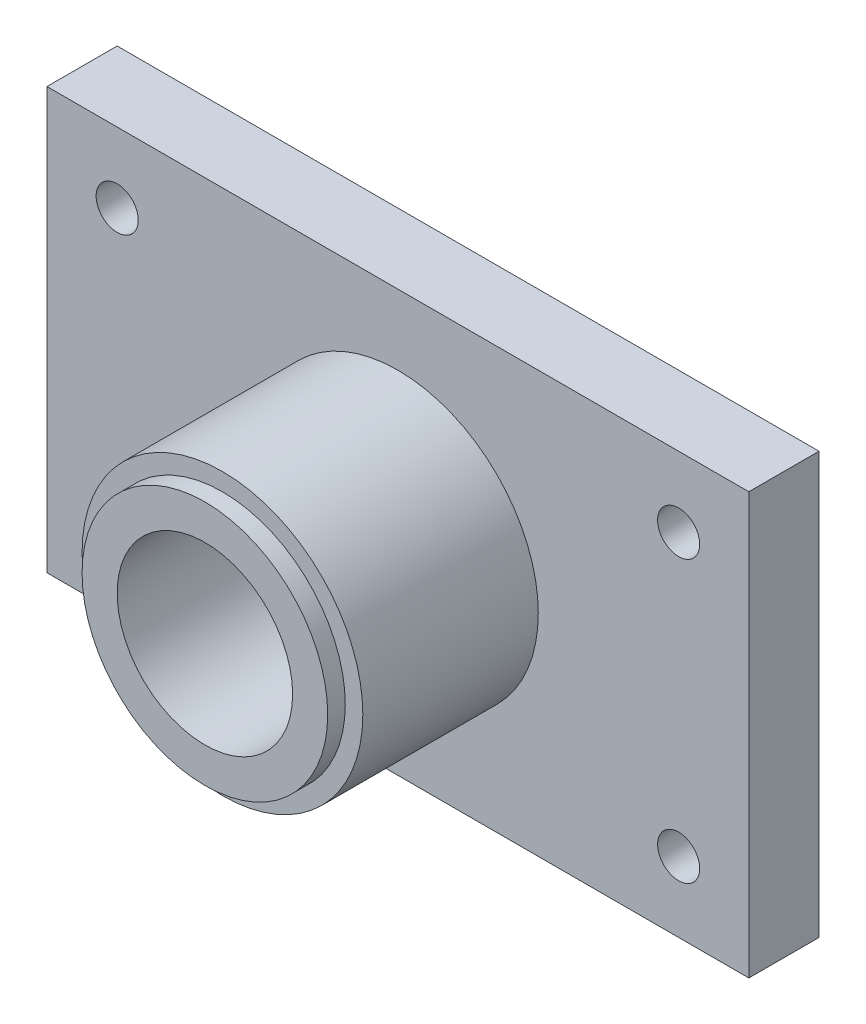
ISO-10303-21;
HEADER;
FILE_DESCRIPTION(('STEP AP214'),'2;1');
FILE_NAME('part.step','',(''),(''),'','','');
FILE_SCHEMA(('AUTOMOTIVE_DESIGN { 1 0 10303 214 1 1 1 1 }'));
ENDSEC;
DATA;
#1=APPLICATION_CONTEXT('core data for automotive mechanical design processes');
#2=APPLICATION_PROTOCOL_DEFINITION('international standard','automotive_design',2000,#1);
#3=PRODUCT_CONTEXT('',#1,'mechanical');
#4=PRODUCT('Part','Part','',(#3));
#5=PRODUCT_RELATED_PRODUCT_CATEGORY('part','',(#4));
#6=PRODUCT_DEFINITION_FORMATION('','',#4);
#7=PRODUCT_DEFINITION_CONTEXT('part definition',#1,'design');
#8=PRODUCT_DEFINITION('design','',#6,#7);
#9=PRODUCT_DEFINITION_SHAPE('','',#8);
#10=(LENGTH_UNIT() NAMED_UNIT(*) SI_UNIT(.MILLI.,.METRE.));
#11=(NAMED_UNIT(*) PLANE_ANGLE_UNIT() SI_UNIT($,.RADIAN.));
#12=(NAMED_UNIT(*) SI_UNIT($,.STERADIAN.) SOLID_ANGLE_UNIT());
#13=UNCERTAINTY_MEASURE_WITH_UNIT(LENGTH_MEASURE(1.E-05),#10,'distance_accuracy_value','');
#14=(GEOMETRIC_REPRESENTATION_CONTEXT(3) GLOBAL_UNCERTAINTY_ASSIGNED_CONTEXT((#13)) GLOBAL_UNIT_ASSIGNED_CONTEXT((#10,
#11,#12)) REPRESENTATION_CONTEXT('',''));
#15=CARTESIAN_POINT('',(0.,0.,0.));
#16=DIRECTION('',(0.,0.,1.));
#17=DIRECTION('',(1.,0.,0.));
#18=AXIS2_PLACEMENT_3D('',#15,#16,#17);
#19=CARTESIAN_POINT('',(0.,0.,20.));
#20=DIRECTION('',(0.,0.,1.));
#21=DIRECTION('',(1.,0.,0.));
#22=AXIS2_PLACEMENT_3D('',#19,#20,#21);
#23=PLANE('',#22);
#24=CARTESIAN_POINT('',(0.,0.,20.));
#25=DIRECTION('',(0.,0.,-1.));
#26=DIRECTION('',(1.,0.,0.));
#27=AXIS2_PLACEMENT_3D('',#24,#25,#26);
#28=CIRCLE('',#27,25.);
#29=CARTESIAN_POINT('',(25.,0.,20.));
#30=VERTEX_POINT('',#29);
#31=EDGE_CURVE('E19',#30,#30,#28,.T.);
#32=ORIENTED_EDGE('',*,*,#31,.F.);
#33=EDGE_LOOP('',(#32));
#34=FACE_BOUND('',#33,.T.);
#35=ADVANCED_FACE('F16',(#34),#23,.T.);
#36=CARTESIAN_POINT('',(0.,0.,0.));
#37=DIRECTION('',(0.,0.,-1.));
#38=DIRECTION('',(1.,0.,0.));
#39=AXIS2_PLACEMENT_3D('',#36,#37,#38);
#40=CYLINDRICAL_SURFACE('',#39,25.);
#41=ORIENTED_EDGE('',*,*,#31,.T.);
#42=DIRECTION('',(0.,0.,1.));
#43=VECTOR('',#42,1.);
#44=CARTESIAN_POINT('',(25.,0.,0.));
#45=LINE('',#44,#43);
#46=CARTESIAN_POINT('',(25.,0.,75.));
#47=VERTEX_POINT('',#46);
#48=EDGE_CURVE('E10',#30,#47,#45,.T.);
#49=ORIENTED_EDGE('',*,*,#48,.T.);
#50=CARTESIAN_POINT('',(0.,0.,75.));
#51=DIRECTION('',(0.,0.,-1.));
#52=DIRECTION('',(1.,0.,0.));
#53=AXIS2_PLACEMENT_3D('',#50,#51,#52);
#54=CIRCLE('',#53,25.);
#55=EDGE_CURVE('E245',#47,#47,#54,.T.);
#56=ORIENTED_EDGE('',*,*,#55,.F.);
#57=ORIENTED_EDGE('',*,*,#48,.F.);
#58=EDGE_LOOP('',(#41,#49,#56,#57));
#59=FACE_BOUND('',#58,.T.);
#60=ADVANCED_FACE('F253',(#59),#40,.F.);
#61=CARTESIAN_POINT('',(0.,0.,75.));
#62=DIRECTION('',(0.,0.,1.));
#63=DIRECTION('',(1.,0.,0.));
#64=AXIS2_PLACEMENT_3D('',#61,#62,#63);
#65=PLANE('',#64);
#66=ORIENTED_EDGE('',*,*,#55,.T.);
#67=EDGE_LOOP('',(#66));
#68=FACE_BOUND('',#67,.T.);
#69=CARTESIAN_POINT('',(0.,0.,75.));
#70=DIRECTION('',(0.,0.,1.));
#71=DIRECTION('',(1.,0.,0.));
#72=AXIS2_PLACEMENT_3D('',#69,#70,#71);
#73=CIRCLE('',#72,35.);
#74=CARTESIAN_POINT('',(35.,0.,75.));
#75=VERTEX_POINT('',#74);
#76=EDGE_CURVE('E243',#75,#75,#73,.T.);
#77=ORIENTED_EDGE('',*,*,#76,.T.);
#78=EDGE_LOOP('',(#77));
#79=FACE_BOUND('',#78,.T.);
#80=ADVANCED_FACE('F260',(#68,#79),#65,.T.);
#81=CARTESIAN_POINT('',(0.,0.,70.));
#82=DIRECTION('',(0.,0.,1.));
#83=DIRECTION('',(1.,0.,0.));
#84=AXIS2_PLACEMENT_3D('',#81,#82,#83);
#85=CYLINDRICAL_SURFACE('',#84,35.);
#86=CARTESIAN_POINT('',(0.,0.,70.));
#87=DIRECTION('',(0.,0.,1.));
#88=DIRECTION('',(1.,0.,0.));
#89=AXIS2_PLACEMENT_3D('',#86,#87,#88);
#90=CIRCLE('',#89,35.);
#91=CARTESIAN_POINT('',(35.,0.,70.));
#92=VERTEX_POINT('',#91);
#93=EDGE_CURVE('E179',#92,#92,#90,.T.);
#94=ORIENTED_EDGE('',*,*,#93,.T.);
#95=DIRECTION('',(0.,0.,1.));
#96=VECTOR('',#95,1.);
#97=CARTESIAN_POINT('',(35.,0.,70.));
#98=LINE('',#97,#96);
#99=EDGE_CURVE('E183',#92,#75,#98,.T.);
#100=ORIENTED_EDGE('',*,*,#99,.T.);
#101=ORIENTED_EDGE('',*,*,#76,.F.);
#102=ORIENTED_EDGE('',*,*,#99,.F.);
#103=EDGE_LOOP('',(#94,#100,#101,#102));
#104=FACE_BOUND('',#103,.T.);
#105=ADVANCED_FACE('F265',(#104),#85,.T.);
#106=CARTESIAN_POINT('',(0.,0.,70.));
#107=DIRECTION('',(0.,0.,1.));
#108=DIRECTION('',(1.,0.,0.));
#109=AXIS2_PLACEMENT_3D('',#106,#107,#108);
#110=PLANE('',#109);
#111=ORIENTED_EDGE('',*,*,#93,.F.);
#112=EDGE_LOOP('',(#111));
#113=FACE_BOUND('',#112,.T.);
#114=CARTESIAN_POINT('',(0.,0.,70.));
#115=DIRECTION('',(0.,0.,-1.));
#116=DIRECTION('',(1.,0.,0.));
#117=AXIS2_PLACEMENT_3D('',#114,#115,#116);
#118=CIRCLE('',#117,40.);
#119=CARTESIAN_POINT('',(40.,0.,70.));
#120=VERTEX_POINT('',#119);
#121=EDGE_CURVE('E184',#120,#120,#118,.T.);
#122=ORIENTED_EDGE('',*,*,#121,.F.);
#123=EDGE_LOOP('',(#122));
#124=FACE_BOUND('',#123,.T.);
#125=ADVANCED_FACE('F290',(#113,#124),#110,.T.);
#126=CARTESIAN_POINT('',(0.,0.,20.));
#127=DIRECTION('',(0.,0.,1.));
#128=DIRECTION('',(1.,0.,0.));
#129=AXIS2_PLACEMENT_3D('',#126,#127,#128);
#130=CYLINDRICAL_SURFACE('',#129,40.);
#131=DIRECTION('',(0.,0.,1.));
#132=VECTOR('',#131,1.);
#133=CARTESIAN_POINT('',(40.,0.,20.));
#134=LINE('',#133,#132);
#135=CARTESIAN_POINT('',(40.,0.,20.));
#136=VERTEX_POINT('',#135);
#137=EDGE_CURVE('E234',#136,#120,#134,.T.);
#138=ORIENTED_EDGE('',*,*,#137,.F.);
#139=CARTESIAN_POINT('',(0.,0.,20.));
#140=DIRECTION('',(0.,0.,-1.));
#141=DIRECTION('',(1.,0.,0.));
#142=AXIS2_PLACEMENT_3D('',#139,#140,#141);
#143=CIRCLE('',#142,40.);
#144=EDGE_CURVE('E230',#136,#136,#143,.T.);
#145=ORIENTED_EDGE('',*,*,#144,.F.);
#146=ORIENTED_EDGE('',*,*,#137,.T.);
#147=ORIENTED_EDGE('',*,*,#121,.T.);
#148=EDGE_LOOP('',(#138,#145,#146,#147));
#149=FACE_BOUND('',#148,.T.);
#150=ADVANCED_FACE('F297',(#149),#130,.T.);
#151=CARTESIAN_POINT('',(0.,0.,20.));
#152=DIRECTION('',(0.,0.,1.));
#153=DIRECTION('',(1.,0.,0.));
#154=AXIS2_PLACEMENT_3D('',#151,#152,#153);
#155=PLANE('',#154);
#156=ORIENTED_EDGE('',*,*,#144,.T.);
#157=EDGE_LOOP('',(#156));
#158=FACE_BOUND('',#157,.T.);
#159=CARTESIAN_POINT('',(80.,40.,20.));
#160=DIRECTION('',(0.,0.,-1.));
#161=DIRECTION('',(1.,0.,0.));
#162=AXIS2_PLACEMENT_3D('',#159,#160,#161);
#163=CIRCLE('',#162,6.);
#164=CARTESIAN_POINT('',(86.,40.,20.));
#165=VERTEX_POINT('',#164);
#166=EDGE_CURVE('E165',#165,#165,#163,.T.);
#167=ORIENTED_EDGE('',*,*,#166,.T.);
#168=EDGE_LOOP('',(#167));
#169=FACE_BOUND('',#168,.T.);
#170=CARTESIAN_POINT('',(-80.,40.,20.));
#171=DIRECTION('',(0.,0.,-1.));
#172=DIRECTION('',(1.,0.,0.));
#173=AXIS2_PLACEMENT_3D('',#170,#171,#172);
#174=CIRCLE('',#173,6.);
#175=CARTESIAN_POINT('',(-74.,40.,20.));
#176=VERTEX_POINT('',#175);
#177=EDGE_CURVE('E166',#176,#176,#174,.T.);
#178=ORIENTED_EDGE('',*,*,#177,.T.);
#179=EDGE_LOOP('',(#178));
#180=FACE_BOUND('',#179,.T.);
#181=CARTESIAN_POINT('',(80.,-40.,20.));
#182=DIRECTION('',(0.,0.,-1.));
#183=DIRECTION('',(1.,0.,0.));
#184=AXIS2_PLACEMENT_3D('',#181,#182,#183);
#185=CIRCLE('',#184,6.);
#186=CARTESIAN_POINT('',(86.,-40.,20.));
#187=VERTEX_POINT('',#186);
#188=EDGE_CURVE('E219',#187,#187,#185,.T.);
#189=ORIENTED_EDGE('',*,*,#188,.T.);
#190=EDGE_LOOP('',(#189));
#191=FACE_BOUND('',#190,.T.);
#192=CARTESIAN_POINT('',(-80.,-40.,20.));
#193=DIRECTION('',(0.,0.,-1.));
#194=DIRECTION('',(1.,0.,0.));
#195=AXIS2_PLACEMENT_3D('',#192,#193,#194);
#196=CIRCLE('',#195,6.);
#197=CARTESIAN_POINT('',(-74.,-40.,20.));
#198=VERTEX_POINT('',#197);
#199=EDGE_CURVE('E212',#198,#198,#196,.T.);
#200=ORIENTED_EDGE('',*,*,#199,.T.);
#201=EDGE_LOOP('',(#200));
#202=FACE_BOUND('',#201,.T.);
#203=DIRECTION('',(1.,0.,0.));
#204=VECTOR('',#203,1.);
#205=CARTESIAN_POINT('',(-100.,-60.,20.));
#206=LINE('',#205,#204);
#207=CARTESIAN_POINT('',(-100.,-60.,20.));
#208=VERTEX_POINT('',#207);
#209=CARTESIAN_POINT('',(100.,-60.,20.));
#210=VERTEX_POINT('',#209);
#211=EDGE_CURVE('E131',#208,#210,#206,.T.);
#212=ORIENTED_EDGE('',*,*,#211,.T.);
#213=DIRECTION('',(0.,1.,0.));
#214=VECTOR('',#213,1.);
#215=CARTESIAN_POINT('',(100.,-60.,20.));
#216=LINE('',#215,#214);
#217=CARTESIAN_POINT('',(100.,60.,20.));
#218=VERTEX_POINT('',#217);
#219=EDGE_CURVE('E201',#210,#218,#216,.T.);
#220=ORIENTED_EDGE('',*,*,#219,.T.);
#221=DIRECTION('',(-1.,0.,0.));
#222=VECTOR('',#221,1.);
#223=CARTESIAN_POINT('',(100.,60.,20.));
#224=LINE('',#223,#222);
#225=CARTESIAN_POINT('',(-100.,60.,20.));
#226=VERTEX_POINT('',#225);
#227=EDGE_CURVE('E205',#218,#226,#224,.T.);
#228=ORIENTED_EDGE('',*,*,#227,.T.);
#229=DIRECTION('',(0.,-1.,0.));
#230=VECTOR('',#229,1.);
#231=CARTESIAN_POINT('',(-100.,60.,20.));
#232=LINE('',#231,#230);
#233=EDGE_CURVE('E135',#226,#208,#232,.T.);
#234=ORIENTED_EDGE('',*,*,#233,.T.);
#235=EDGE_LOOP('',(#212,#220,#228,#234));
#236=FACE_BOUND('',#235,.T.);
#237=ADVANCED_FACE('F302',(#158,#169,#180,#191,#202,#236),#155,.T.);
#238=CARTESIAN_POINT('',(80.,40.,0.));
#239=DIRECTION('',(0.,0.,-1.));
#240=DIRECTION('',(1.,0.,0.));
#241=AXIS2_PLACEMENT_3D('',#238,#239,#240);
#242=CYLINDRICAL_SURFACE('',#241,6.);
#243=CARTESIAN_POINT('',(80.,40.,0.));
#244=DIRECTION('',(0.,0.,1.));
#245=DIRECTION('',(1.,0.,0.));
#246=AXIS2_PLACEMENT_3D('',#243,#244,#245);
#247=CIRCLE('',#246,6.);
#248=CARTESIAN_POINT('',(86.,40.,0.));
#249=VERTEX_POINT('',#248);
#250=EDGE_CURVE('E173',#249,#249,#247,.T.);
#251=ORIENTED_EDGE('',*,*,#250,.F.);
#252=DIRECTION('',(0.,0.,1.));
#253=VECTOR('',#252,1.);
#254=CARTESIAN_POINT('',(86.,40.,0.));
#255=LINE('',#254,#253);
#256=EDGE_CURVE('E161',#249,#165,#255,.T.);
#257=ORIENTED_EDGE('',*,*,#256,.T.);
#258=ORIENTED_EDGE('',*,*,#166,.F.);
#259=ORIENTED_EDGE('',*,*,#256,.F.);
#260=EDGE_LOOP('',(#251,#257,#258,#259));
#261=FACE_BOUND('',#260,.T.);
#262=ADVANCED_FACE('F299',(#261),#242,.F.);
#263=CARTESIAN_POINT('',(-80.,40.,0.));
#264=DIRECTION('',(0.,0.,-1.));
#265=DIRECTION('',(1.,0.,0.));
#266=AXIS2_PLACEMENT_3D('',#263,#264,#265);
#267=CYLINDRICAL_SURFACE('',#266,6.);
#268=CARTESIAN_POINT('',(-80.,40.,0.));
#269=DIRECTION('',(0.,0.,1.));
#270=DIRECTION('',(1.,0.,0.));
#271=AXIS2_PLACEMENT_3D('',#268,#269,#270);
#272=CIRCLE('',#271,6.);
#273=CARTESIAN_POINT('',(-74.,40.,0.));
#274=VERTEX_POINT('',#273);
#275=EDGE_CURVE('E169',#274,#274,#272,.T.);
#276=ORIENTED_EDGE('',*,*,#275,.F.);
#277=DIRECTION('',(0.,0.,1.));
#278=VECTOR('',#277,1.);
#279=CARTESIAN_POINT('',(-74.,40.,0.));
#280=LINE('',#279,#278);
#281=EDGE_CURVE('E222',#274,#176,#280,.T.);
#282=ORIENTED_EDGE('',*,*,#281,.T.);
#283=ORIENTED_EDGE('',*,*,#177,.F.);
#284=ORIENTED_EDGE('',*,*,#281,.F.);
#285=EDGE_LOOP('',(#276,#282,#283,#284));
#286=FACE_BOUND('',#285,.T.);
#287=ADVANCED_FACE('F279',(#286),#267,.F.);
#288=CARTESIAN_POINT('',(80.,-40.,0.));
#289=DIRECTION('',(0.,0.,-1.));
#290=DIRECTION('',(1.,0.,0.));
#291=AXIS2_PLACEMENT_3D('',#288,#289,#290);
#292=CYLINDRICAL_SURFACE('',#291,6.);
#293=CARTESIAN_POINT('',(80.,-40.,0.));
#294=DIRECTION('',(0.,0.,1.));
#295=DIRECTION('',(1.,0.,0.));
#296=AXIS2_PLACEMENT_3D('',#293,#294,#295);
#297=CIRCLE('',#296,6.);
#298=CARTESIAN_POINT('',(86.,-40.,0.));
#299=VERTEX_POINT('',#298);
#300=EDGE_CURVE('E159',#299,#299,#297,.T.);
#301=ORIENTED_EDGE('',*,*,#300,.F.);
#302=DIRECTION('',(0.,0.,1.));
#303=VECTOR('',#302,1.);
#304=CARTESIAN_POINT('',(86.,-40.,0.));
#305=LINE('',#304,#303);
#306=EDGE_CURVE('E215',#299,#187,#305,.T.);
#307=ORIENTED_EDGE('',*,*,#306,.T.);
#308=ORIENTED_EDGE('',*,*,#188,.F.);
#309=ORIENTED_EDGE('',*,*,#306,.F.);
#310=EDGE_LOOP('',(#301,#307,#308,#309));
#311=FACE_BOUND('',#310,.T.);
#312=ADVANCED_FACE('F275',(#311),#292,.F.);
#313=CARTESIAN_POINT('',(-80.,-40.,0.));
#314=DIRECTION('',(0.,0.,-1.));
#315=DIRECTION('',(1.,0.,0.));
#316=AXIS2_PLACEMENT_3D('',#313,#314,#315);
#317=CYLINDRICAL_SURFACE('',#316,6.);
#318=CARTESIAN_POINT('',(-80.,-40.,0.));
#319=DIRECTION('',(0.,0.,1.));
#320=DIRECTION('',(1.,0.,0.));
#321=AXIS2_PLACEMENT_3D('',#318,#319,#320);
#322=CIRCLE('',#321,6.);
#323=CARTESIAN_POINT('',(-74.,-40.,0.));
#324=VERTEX_POINT('',#323);
#325=EDGE_CURVE('E157',#324,#324,#322,.T.);
#326=ORIENTED_EDGE('',*,*,#325,.F.);
#327=DIRECTION('',(0.,0.,1.));
#328=VECTOR('',#327,1.);
#329=CARTESIAN_POINT('',(-74.,-40.,0.));
#330=LINE('',#329,#328);
#331=EDGE_CURVE('E207',#324,#198,#330,.T.);
#332=ORIENTED_EDGE('',*,*,#331,.T.);
#333=ORIENTED_EDGE('',*,*,#199,.F.);
#334=ORIENTED_EDGE('',*,*,#331,.F.);
#335=EDGE_LOOP('',(#326,#332,#333,#334));
#336=FACE_BOUND('',#335,.T.);
#337=ADVANCED_FACE('F278',(#336),#317,.F.);
#338=CARTESIAN_POINT('',(100.,60.,0.));
#339=DIRECTION('',(0.,-1.,0.));
#340=DIRECTION('',(0.,0.,-1.));
#341=AXIS2_PLACEMENT_3D('',#338,#339,#340);
#342=PLANE('',#341);
#343=DIRECTION('',(-1.,0.,0.));
#344=VECTOR('',#343,1.);
#345=CARTESIAN_POINT('',(100.,60.,0.));
#346=LINE('',#345,#344);
#347=CARTESIAN_POINT('',(100.,60.,0.));
#348=VERTEX_POINT('',#347);
#349=CARTESIAN_POINT('',(-100.,60.,0.));
#350=VERTEX_POINT('',#349);
#351=EDGE_CURVE('E146',#348,#350,#346,.T.);
#352=ORIENTED_EDGE('',*,*,#351,.T.);
#353=DIRECTION('',(0.,0.,1.));
#354=VECTOR('',#353,1.);
#355=CARTESIAN_POINT('',(-100.,60.,0.));
#356=LINE('',#355,#354);
#357=EDGE_CURVE('E141',#350,#226,#356,.T.);
#358=ORIENTED_EDGE('',*,*,#357,.T.);
#359=ORIENTED_EDGE('',*,*,#227,.F.);
#360=DIRECTION('',(0.,0.,1.));
#361=VECTOR('',#360,1.);
#362=CARTESIAN_POINT('',(100.,60.,0.));
#363=LINE('',#362,#361);
#364=EDGE_CURVE('E197',#348,#218,#363,.T.);
#365=ORIENTED_EDGE('',*,*,#364,.F.);
#366=EDGE_LOOP('',(#352,#358,#359,#365));
#367=FACE_BOUND('',#366,.T.);
#368=ADVANCED_FACE('F283',(#367),#342,.F.);
#369=CARTESIAN_POINT('',(100.,-60.,0.));
#370=DIRECTION('',(-1.,0.,0.));
#371=DIRECTION('',(0.,0.,1.));
#372=AXIS2_PLACEMENT_3D('',#369,#370,#371);
#373=PLANE('',#372);
#374=DIRECTION('',(0.,1.,0.));
#375=VECTOR('',#374,1.);
#376=CARTESIAN_POINT('',(100.,-60.,0.));
#377=LINE('',#376,#375);
#378=CARTESIAN_POINT('',(100.,-60.,0.));
#379=VERTEX_POINT('',#378);
#380=EDGE_CURVE('E151',#379,#348,#377,.T.);
#381=ORIENTED_EDGE('',*,*,#380,.T.);
#382=ORIENTED_EDGE('',*,*,#364,.T.);
#383=ORIENTED_EDGE('',*,*,#219,.F.);
#384=DIRECTION('',(0.,0.,1.));
#385=VECTOR('',#384,1.);
#386=CARTESIAN_POINT('',(100.,-60.,0.));
#387=LINE('',#386,#385);
#388=EDGE_CURVE('E188',#379,#210,#387,.T.);
#389=ORIENTED_EDGE('',*,*,#388,.F.);
#390=EDGE_LOOP('',(#381,#382,#383,#389));
#391=FACE_BOUND('',#390,.T.);
#392=ADVANCED_FACE('F274',(#391),#373,.F.);
#393=CARTESIAN_POINT('',(-100.,60.,0.));
#394=DIRECTION('',(1.,0.,0.));
#395=DIRECTION('',(0.,1.,0.));
#396=AXIS2_PLACEMENT_3D('',#393,#394,#395);
#397=PLANE('',#396);
#398=DIRECTION('',(0.,-1.,0.));
#399=VECTOR('',#398,1.);
#400=CARTESIAN_POINT('',(-100.,60.,0.));
#401=LINE('',#400,#399);
#402=CARTESIAN_POINT('',(-100.,-60.,0.));
#403=VERTEX_POINT('',#402);
#404=EDGE_CURVE('E138',#350,#403,#401,.T.);
#405=ORIENTED_EDGE('',*,*,#404,.T.);
#406=DIRECTION('',(0.,0.,1.));
#407=VECTOR('',#406,1.);
#408=CARTESIAN_POINT('',(-100.,-60.,0.));
#409=LINE('',#408,#407);
#410=EDGE_CURVE('E124',#403,#208,#409,.T.);
#411=ORIENTED_EDGE('',*,*,#410,.T.);
#412=ORIENTED_EDGE('',*,*,#233,.F.);
#413=ORIENTED_EDGE('',*,*,#357,.F.);
#414=EDGE_LOOP('',(#405,#411,#412,#413));
#415=FACE_BOUND('',#414,.T.);
#416=ADVANCED_FACE('F139',(#415),#397,.F.);
#417=CARTESIAN_POINT('',(-100.,-60.,0.));
#418=DIRECTION('',(0.,1.,0.));
#419=DIRECTION('',(1.,0.,0.));
#420=AXIS2_PLACEMENT_3D('',#417,#418,#419);
#421=PLANE('',#420);
#422=DIRECTION('',(1.,0.,0.));
#423=VECTOR('',#422,1.);
#424=CARTESIAN_POINT('',(-100.,-60.,0.));
#425=LINE('',#424,#423);
#426=EDGE_CURVE('E129',#403,#379,#425,.T.);
#427=ORIENTED_EDGE('',*,*,#426,.T.);
#428=ORIENTED_EDGE('',*,*,#388,.T.);
#429=ORIENTED_EDGE('',*,*,#211,.F.);
#430=ORIENTED_EDGE('',*,*,#410,.F.);
#431=EDGE_LOOP('',(#427,#428,#429,#430));
#432=FACE_BOUND('',#431,.T.);
#433=ADVANCED_FACE('F126',(#432),#421,.F.);
#434=CARTESIAN_POINT('',(0.,0.,0.));
#435=DIRECTION('',(0.,0.,1.));
#436=DIRECTION('',(1.,0.,0.));
#437=AXIS2_PLACEMENT_3D('',#434,#435,#436);
#438=PLANE('',#437);
#439=ORIENTED_EDGE('',*,*,#250,.T.);
#440=EDGE_LOOP('',(#439));
#441=FACE_BOUND('',#440,.T.);
#442=ORIENTED_EDGE('',*,*,#275,.T.);
#443=EDGE_LOOP('',(#442));
#444=FACE_BOUND('',#443,.T.);
#445=ORIENTED_EDGE('',*,*,#300,.T.);
#446=EDGE_LOOP('',(#445));
#447=FACE_BOUND('',#446,.T.);
#448=ORIENTED_EDGE('',*,*,#325,.T.);
#449=EDGE_LOOP('',(#448));
#450=FACE_BOUND('',#449,.T.);
#451=ORIENTED_EDGE('',*,*,#426,.F.);
#452=ORIENTED_EDGE('',*,*,#404,.F.);
#453=ORIENTED_EDGE('',*,*,#351,.F.);
#454=ORIENTED_EDGE('',*,*,#380,.F.);
#455=EDGE_LOOP('',(#451,#452,#453,#454));
#456=FACE_BOUND('',#455,.T.);
#457=ADVANCED_FACE('F149',(#441,#444,#447,#450,#456),#438,.F.);
#458=CLOSED_SHELL('',(#35,#60,#80,#105,#125,#150,#237,#262,#287,#312,#337,#368,#392,#416,#433,#457));
#459=MANIFOLD_SOLID_BREP('B1',#458);
#460=ADVANCED_BREP_SHAPE_REPRESENTATION('',(#18,#459),#14);
#461=SHAPE_DEFINITION_REPRESENTATION(#9,#460);
ENDSEC;
END-ISO-10303-21;
